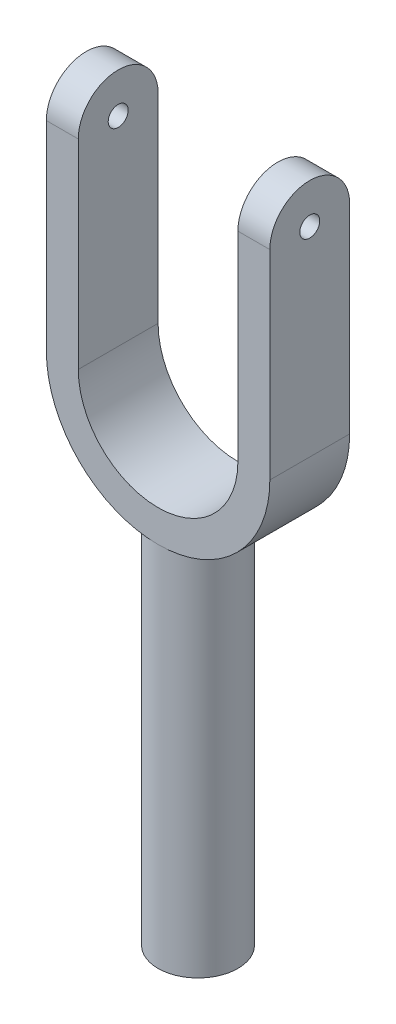
ISO-10303-21;
HEADER;
FILE_DESCRIPTION(('STEP AP214'),'2;1');
FILE_NAME('part.step','',(''),(''),'','','');
FILE_SCHEMA(('AUTOMOTIVE_DESIGN { 1 0 10303 214 1 1 1 1 }'));
ENDSEC;
DATA;
#1=APPLICATION_CONTEXT('core data for automotive mechanical design processes');
#2=APPLICATION_PROTOCOL_DEFINITION('international standard','automotive_design',2000,#1);
#3=PRODUCT_CONTEXT('',#1,'mechanical');
#4=PRODUCT('Part','Part','',(#3));
#5=PRODUCT_RELATED_PRODUCT_CATEGORY('part','',(#4));
#6=PRODUCT_DEFINITION_FORMATION('','',#4);
#7=PRODUCT_DEFINITION_CONTEXT('part definition',#1,'design');
#8=PRODUCT_DEFINITION('design','',#6,#7);
#9=PRODUCT_DEFINITION_SHAPE('','',#8);
#10=(LENGTH_UNIT() NAMED_UNIT(*) SI_UNIT(.MILLI.,.METRE.));
#11=(NAMED_UNIT(*) PLANE_ANGLE_UNIT() SI_UNIT($,.RADIAN.));
#12=(NAMED_UNIT(*) SI_UNIT($,.STERADIAN.) SOLID_ANGLE_UNIT());
#13=UNCERTAINTY_MEASURE_WITH_UNIT(LENGTH_MEASURE(1.E-05),#10,'distance_accuracy_value','');
#14=(GEOMETRIC_REPRESENTATION_CONTEXT(3) GLOBAL_UNCERTAINTY_ASSIGNED_CONTEXT((#13)) GLOBAL_UNIT_ASSIGNED_CONTEXT((#10,
#11,#12)) REPRESENTATION_CONTEXT('',''));
#15=CARTESIAN_POINT('',(0.,0.,0.));
#16=DIRECTION('',(0.,0.,1.));
#17=DIRECTION('',(1.,0.,0.));
#18=AXIS2_PLACEMENT_3D('',#15,#16,#17);
#19=CARTESIAN_POINT('',(0.,0.,25.));
#20=DIRECTION('',(0.,0.,-1.));
#21=DIRECTION('',(-1.,0.,0.));
#22=AXIS2_PLACEMENT_3D('',#19,#20,#21);
#23=CYLINDRICAL_SURFACE('',#22,70.0000000000001);
#24=CARTESIAN_POINT('',(0.,-70.0000000000001,-25.));
#25=CARTESIAN_POINT('',(-0.679180925944925,-70.0000012701264,-25.0000017888725));
#26=CARTESIAN_POINT('',(-1.35833593576467,-69.9900934101398,-24.9723012200254));
#27=CARTESIAN_POINT('',(-2.71154794711081,-69.9507371047099,-24.8617839545253));
#28=CARTESIAN_POINT('',(-3.38560520508728,-69.9212896489382,-24.7789700493372));
#29=CARTESIAN_POINT('',(-4.72365419045248,-69.8436555704296,-24.5590468551552));
#30=CARTESIAN_POINT('',(-5.38764644172705,-69.7954699265233,-24.4219404022457));
#31=CARTESIAN_POINT('',(-6.70090631634505,-69.6816496745706,-24.0947257261692));
#32=CARTESIAN_POINT('',(-7.3501736775428,-69.6160147561408,-23.9046165602));
#33=CARTESIAN_POINT('',(-8.62837866468457,-69.4691601054934,-23.4734993431677));
#34=CARTESIAN_POINT('',(-9.2573520122148,-69.3879697246476,-23.2325870669071));
#35=CARTESIAN_POINT('',(-10.4922185459502,-69.2120102997683,-22.701653568678));
#36=CARTESIAN_POINT('',(-11.0981118604151,-69.1172413312072,-22.4116326196635));
#37=CARTESIAN_POINT('',(-12.2832846972124,-68.9164875007838,-21.7846375289411));
#38=CARTESIAN_POINT('',(-12.8625593297818,-68.8105005899416,-21.4476548059983));
#39=CARTESIAN_POINT('',(-13.9910496212934,-68.5899495050605,-20.7291597525745));
#40=CARTESIAN_POINT('',(-14.5402644271045,-68.4753850878008,-20.3476461592197));
#41=CARTESIAN_POINT('',(-15.6244442062578,-68.2363214951697,-19.5282976693321));
#42=CARTESIAN_POINT('',(-16.1582260560632,-68.1116145298589,-19.0889524001093));
#43=CARTESIAN_POINT('',(-16.9298278264603,-67.9223907842319,-18.3983740008551));
#44=CARTESIAN_POINT('',(-17.1821959894187,-67.8589521964708,-18.1629076594081));
#45=CARTESIAN_POINT('',(-17.6769930980779,-67.7317441516165,-17.6817144778725));
#46=CARTESIAN_POINT('',(-17.919419620755,-67.66797461808,-17.4359851655546));
#47=CARTESIAN_POINT('',(-18.6311822417452,-67.4768135765647,-16.6839872261996));
#48=CARTESIAN_POINT('',(-19.0850367431888,-67.3495608681547,-16.162876950687));
#49=CARTESIAN_POINT('',(-19.9484583144465,-67.0988912003716,-15.0843031394537));
#50=CARTESIAN_POINT('',(-20.3580255554341,-66.9754742261743,-14.5268397442538));
#51=CARTESIAN_POINT('',(-20.9436789370133,-66.7937572348368,-13.6561452204844));
#52=CARTESIAN_POINT('',(-21.1370153397241,-66.7327887338265,-13.3549520302421));
#53=CARTESIAN_POINT('',(-21.5107327660702,-66.6132632569046,-12.7442736575752));
#54=CARTESIAN_POINT('',(-21.6911168736069,-66.5547057083786,-12.4347904732291));
#55=CARTESIAN_POINT('',(-22.2124099879301,-66.3833020172012,-11.4944495413271));
#56=CARTESIAN_POINT('',(-22.5334927319814,-66.2747144923099,-10.8516514539638));
#57=CARTESIAN_POINT('',(-23.1197452689608,-66.0724874425329,-9.53907830218651));
#58=CARTESIAN_POINT('',(-23.3849306630139,-65.9788437485546,-8.8693108273363));
#59=CARTESIAN_POINT('',(-23.8570656154869,-65.8095995522291,-7.50731237889064));
#60=CARTESIAN_POINT('',(-24.0640182337097,-65.7339981018958,-6.81508258769537));
#61=CARTESIAN_POINT('',(-24.4108560480382,-65.6059676833894,-5.44001058565263));
#62=CARTESIAN_POINT('',(-24.5529838744494,-65.5527697368865,-4.75780527226331));
#63=CARTESIAN_POINT('',(-24.7799009878715,-65.4673297562468,-3.38261677847237));
#64=CARTESIAN_POINT('',(-24.8646916243141,-65.4350872289246,-2.68963385211474));
#65=CARTESIAN_POINT('',(-24.975998661004,-65.39268349225,-1.29854767890296));
#66=CARTESIAN_POINT('',(-25.0025334156344,-65.3825153280521,-0.600446114323008));
#67=CARTESIAN_POINT('',(-24.997086189663,-65.3845984253853,0.795482850485619));
#68=CARTESIAN_POINT('',(-24.9651061933431,-65.3968489266816,1.49331025920851));
#69=CARTESIAN_POINT('',(-24.8462687705805,-65.4420862116418,2.84584995416015));
#70=CARTESIAN_POINT('',(-24.7624422149918,-65.4739272568418,3.50086970397224));
#71=CARTESIAN_POINT('',(-24.543520870307,-65.5563059118841,4.80105803799633));
#72=CARTESIAN_POINT('',(-24.4084281849751,-65.606842754521,5.44622702531565));
#73=CARTESIAN_POINT('',(-24.0882016135211,-65.7250912835406,6.72245812130035));
#74=CARTESIAN_POINT('',(-23.9030629687172,-65.7928046031319,7.35351888228634));
#75=CARTESIAN_POINT('',(-23.4843347268727,-65.943426326895,8.59748546358401));
#76=CARTESIAN_POINT('',(-23.2507436769573,-66.0263351867055,9.21039073886254));
#77=CARTESIAN_POINT('',(-22.7324023274212,-66.2066043754767,10.4250470845983));
#78=CARTESIAN_POINT('',(-22.4468192484161,-66.3041946397133,11.026408369599));
#79=CARTESIAN_POINT('',(-21.8295020221087,-66.5099889957458,12.2030422211796));
#80=CARTESIAN_POINT('',(-21.4977676465952,-66.6181931400249,12.7783146587354));
#81=CARTESIAN_POINT('',(-20.790314154227,-66.8423558537089,13.8997313280232));
#82=CARTESIAN_POINT('',(-20.4145835221899,-66.9583164497971,14.4458678793042));
#83=CARTESIAN_POINT('',(-19.6214589540957,-67.1950111379271,15.5060152473019));
#84=CARTESIAN_POINT('',(-19.204063316814,-67.315745424762,16.020024750844));
#85=CARTESIAN_POINT('',(-18.5353963295366,-67.5018294366563,16.779815311856));
#86=CARTESIAN_POINT('',(-18.2981469798808,-67.5665659694663,17.0382161934338));
#87=CARTESIAN_POINT('',(-17.8130541374479,-67.696071716854,17.5447442620807));
#88=CARTESIAN_POINT('',(-17.5652130984215,-67.7608409204637,17.7928738027443));
#89=CARTESIAN_POINT('',(-16.8062137216077,-67.9545709111255,18.521418592806));
#90=CARTESIAN_POINT('',(-16.2795515055306,-68.0829618451124,18.986021386256));
#91=CARTESIAN_POINT('',(-15.188263819508,-68.334693165841,19.8698224306004));
#92=CARTESIAN_POINT('',(-14.6236332005377,-68.4580328639032,20.2890145029842));
#93=CARTESIAN_POINT('',(-13.4598154912955,-68.696332395009,21.0790880589463));
#94=CARTESIAN_POINT('',(-12.8606286361773,-68.8112922850647,21.4499698712182));
#95=CARTESIAN_POINT('',(-11.6235005765033,-69.031108593913,22.1450699786553));
#96=CARTESIAN_POINT('',(-10.9851584227713,-69.1358151381548,22.4686228350996));
#97=CARTESIAN_POINT('',(-9.68116320804216,-69.330437610488,23.0605233270113));
#98=CARTESIAN_POINT('',(-9.01550971611939,-69.4203533050932,23.32887009102));
#99=CARTESIAN_POINT('',(-7.66189266903238,-69.5827554722577,23.8077849637237));
#100=CARTESIAN_POINT('',(-6.97393644485921,-69.6552476073866,24.0183718472401));
#101=CARTESIAN_POINT('',(-5.58075891840453,-69.780686155583,24.3797647320112));
#102=CARTESIAN_POINT('',(-4.87553854461499,-69.8336336173406,24.5305739407325));
#103=CARTESIAN_POINT('',(-3.48828154365024,-69.9163135002796,24.7649405971046));
#104=CARTESIAN_POINT('',(-2.80679875640182,-69.9470549990155,24.8514274091529));
#105=CARTESIAN_POINT('',(-1.4384274815666,-69.9885661065252,24.9680271662592));
#106=CARTESIAN_POINT('',(-0.751539171185793,-69.9993363672876,24.9981419516601));
#107=CARTESIAN_POINT('',(0.622278307785202,-70.0006039599694,25.0016909644371));
#108=CARTESIAN_POINT('',(1.30920744823897,-69.9911048357362,24.9751350999651));
#109=CARTESIAN_POINT('',(2.67797546770134,-69.9521064050935,24.8656350826399));
#110=CARTESIAN_POINT('',(3.3598144118618,-69.9226073551178,24.7826916527737));
#111=CARTESIAN_POINT('',(4.69009118571935,-69.8457708674575,24.5650496063379));
#112=CARTESIAN_POINT('',(5.3388733986258,-69.7990786481027,24.4322198884995));
#113=CARTESIAN_POINT('',(6.62250574852431,-69.6890047457768,24.1159562759875));
#114=CARTESIAN_POINT('',(7.25735628739102,-69.6256235449054,23.9325238430826));
#115=CARTESIAN_POINT('',(8.5090871904933,-69.483755219678,23.5165990158715));
#116=CARTESIAN_POINT('',(9.12596602540446,-69.4052668140538,23.2841024601904));
#117=CARTESIAN_POINT('',(10.3379070082423,-69.2351228512165,22.7719247950542));
#118=CARTESIAN_POINT('',(10.9329684834825,-69.1434668884409,22.4922422322174));
#119=CARTESIAN_POINT('',(12.1143177985488,-68.9464417431281,21.8791779623532));
#120=CARTESIAN_POINT('',(12.699885591798,-68.8407588547123,21.5445048798973));
#121=CARTESIAN_POINT('',(13.5554826550168,-68.6755663592855,21.0086229040792));
#122=CARTESIAN_POINT('',(13.8369034497344,-68.6193877016691,20.8243395970423));
#123=CARTESIAN_POINT('',(14.3918898304214,-68.5051368369523,20.4447193932805));
#124=CARTESIAN_POINT('',(14.6654536730783,-68.447064215628,20.2493800715593));
#125=CARTESIAN_POINT('',(15.4737493174401,-68.2705438234234,19.6472517054354));
#126=CARTESIAN_POINT('',(15.9960963972219,-68.1497913474794,19.2243452643792));
#127=CARTESIAN_POINT('',(17.0046656411807,-67.9051597013927,18.3382651998405));
#128=CARTESIAN_POINT('',(17.4908866535014,-67.7812804317226,17.875090293445));
#129=CARTESIAN_POINT('',(18.2033281374715,-67.5921853425137,17.1395335672721));
#130=CARTESIAN_POINT('',(18.4436363511331,-67.5269695119449,16.8806692677433));
#131=CARTESIAN_POINT('',(18.9130682113762,-67.3969965735359,16.3529977617922));
#132=CARTESIAN_POINT('',(19.1421944546978,-67.3322393622075,16.0841928895581));
#133=CARTESIAN_POINT('',(19.8123770498557,-67.1393016789484,15.2633102174337));
#134=CARTESIAN_POINT('',(20.2362684867918,-67.0124467811318,14.6967321269497));
#135=CARTESIAN_POINT('',(21.0351438505253,-66.7659914056939,13.5286203723206));
#136=CARTESIAN_POINT('',(21.4101240325835,-66.6463914839019,12.927084036796));
#137=CARTESIAN_POINT('',(22.1084268113351,-66.4180129691599,11.6927399359435));
#138=CARTESIAN_POINT('',(22.431750264472,-66.3092341968118,11.0599326893));
#139=CARTESIAN_POINT('',(23.0244122761999,-66.1057849188638,9.76642771567463));
#140=CARTESIAN_POINT('',(23.2936890209956,-66.011130598921,9.10569908804534));
#141=CARTESIAN_POINT('',(23.7753512389981,-65.8391839589918,7.76159023189796));
#142=CARTESIAN_POINT('',(23.9877363589474,-65.7618917468126,7.07820986275789));
#143=CARTESIAN_POINT('',(24.3534019606598,-65.6273557048357,5.69419578711899));
#144=CARTESIAN_POINT('',(24.5067092367632,-65.57010278744,4.99357005588981));
#145=CARTESIAN_POINT('',(24.7526885085429,-65.4776432207795,3.58032834450137));
#146=CARTESIAN_POINT('',(24.8453641951103,-65.442435229556,2.86771309690197));
#147=CARTESIAN_POINT('',(24.9654052979338,-65.3967304134161,1.4784360537139));
#148=CARTESIAN_POINT('',(24.9962853133434,-65.3849042764544,0.802119432788617));
#149=CARTESIAN_POINT('',(25.0030831458586,-65.3823055037871,-0.550815464009211));
#150=CARTESIAN_POINT('',(24.9790032135198,-65.3915320059966,-1.22743372639548));
#151=CARTESIAN_POINT('',(24.8761389677405,-65.430732146903,-2.57582777984353));
#152=CARTESIAN_POINT('',(24.7973588941999,-65.4607041775784,-3.24760394214726));
#153=CARTESIAN_POINT('',(24.5859014832569,-65.5404164074589,-4.58141863365554));
#154=CARTESIAN_POINT('',(24.4532240750698,-65.5901566326261,-5.24345715007022));
#155=CARTESIAN_POINT('',(24.1392673145603,-65.7063391421672,-6.5366135458405));
#156=CARTESIAN_POINT('',(23.9592947388971,-65.7723297285596,-7.16809030267321));
#157=CARTESIAN_POINT('',(23.550915918976,-65.9196589543378,-8.41330511763138));
#158=CARTESIAN_POINT('',(23.3225108136794,-66.0009972327955,-9.02704359251271));
#159=CARTESIAN_POINT('',(22.8190253697003,-66.1767567147497,-10.2332429747148));
#160=CARTESIAN_POINT('',(22.5439365925244,-66.271180282963,-10.8257000117232));
#161=CARTESIAN_POINT('',(21.9491119288141,-66.4705563083536,-11.9858898777569));
#162=CARTESIAN_POINT('',(21.62937422138,-66.5755091948947,-12.5536216971839));
#163=CARTESIAN_POINT('',(20.9306661136645,-66.7985634818032,-13.6884048682217));
#164=CARTESIAN_POINT('',(20.5495684648305,-66.9170563964142,-14.2540747323218));
#165=CARTESIAN_POINT('',(19.944834894965,-67.0987918724771,-15.0771203483552));
#166=CARTESIAN_POINT('',(19.7377296955177,-67.1600400091216,-15.3472404518126));
#167=CARTESIAN_POINT('',(19.3127282349984,-67.283486184683,-15.8787380823859));
#168=CARTESIAN_POINT('',(19.0948295089143,-67.3456844383223,-16.1401135893742));
#169=CARTESIAN_POINT('',(18.4254515729339,-67.5330837813454,-16.910516389615));
#170=CARTESIAN_POINT('',(17.9582724294438,-67.659094971113,-17.4058446891676));
#171=CARTESIAN_POINT('',(16.9849134079008,-67.9099788014804,-18.3568979844149));
#172=CARTESIAN_POINT('',(16.4787330340364,-68.0348514275834,-18.812622476481));
#173=CARTESIAN_POINT('',(15.6800440547176,-68.2218131655967,-19.4746870791341));
#174=CARTESIAN_POINT('',(15.4005634513176,-68.2854841678105,-19.6964452925057));
#175=CARTESIAN_POINT('',(14.8322073101845,-68.4111857699624,-20.1279137366329));
#176=CARTESIAN_POINT('',(14.5433339875633,-68.4732167505039,-20.3376267762217));
#177=CARTESIAN_POINT('',(13.6631190242182,-68.6562311499885,-20.9482461174024));
#178=CARTESIAN_POINT('',(13.0581398738707,-68.7741460824937,-21.3306678905265));
#179=CARTESIAN_POINT('',(11.8160736836227,-68.9983965375514,-22.0429819433391));
#180=CARTESIAN_POINT('',(11.1789876455057,-69.104732421061,-22.3728758606423));
#181=CARTESIAN_POINT('',(9.87690039706431,-69.3028164292254,-22.9774226912103));
#182=CARTESIAN_POINT('',(9.2118996022049,-69.3945647708944,-23.2520764262818));
#183=CARTESIAN_POINT('',(7.85586876974843,-69.5611522427746,-23.7446393332485));
#184=CARTESIAN_POINT('',(7.16473975510546,-69.6359175351333,-23.9623013227626));
#185=CARTESIAN_POINT('',(5.76443021358274,-69.7657917941298,-24.3371455055395));
#186=CARTESIAN_POINT('',(5.05524946975612,-69.8209005244139,-24.4943269715772));
#187=CARTESIAN_POINT('',(3.62482047042624,-69.9097560489538,-24.7464730416028));
#188=CARTESIAN_POINT('',(2.90357623849649,-69.9435098255037,-24.8414579819513));
#189=CARTESIAN_POINT('',(1.45487783958914,-69.9886304356377,-24.9682185684781));
#190=CARTESIAN_POINT('',(0.727424055495679,-69.9999986396551,-24.9999980840615));
#191=CARTESIAN_POINT('',(0.,-70.0000000000001,-25.));
#192=B_SPLINE_CURVE_WITH_KNOTS('',3,(#24,#25,#26,#27,#28,#29,#30,#31,#32,#33,#34,#35,#36,#37,
#38,#39,#40,#41,#42,#43,#44,#45,#46,#47,#48,#49,#50,#51,#52,#53,#54,#55,#56,#57,#58,#59,#60,#61,
#62,#63,#64,#65,#66,#67,#68,#69,#70,#71,#72,#73,#74,#75,#76,#77,#78,#79,#80,#81,#82,#83,#84,#85,
#86,#87,#88,#89,#90,#91,#92,#93,#94,#95,#96,#97,#98,#99,#100,#101,#102,#103,#104,#105,#106,#107,
#108,#109,#110,#111,#112,#113,#114,#115,#116,#117,#118,#119,#120,#121,#122,#123,#124,#125,#126,
#127,#128,#129,#130,#131,#132,#133,#134,#135,#136,#137,#138,#139,#140,#141,#142,#143,#144,#145,
#146,#147,#148,#149,#150,#151,#152,#153,#154,#155,#156,#157,#158,#159,#160,#161,#162,#163,#164,
#165,#166,#167,#168,#169,#170,#171,#172,#173,#174,#175,#176,#177,#178,#179,#180,#181,#182,#183,
#184,#185,#186,#187,#188,#189,#190,#191),.UNSPECIFIED.,.T.,.F.,(4,2,2,2,2,2,2,2,2,2,2,2,2,2,2,2,
2,2,2,2,2,2,2,2,2,2,2,2,2,2,2,2,2,2,2,2,2,2,2,2,2,2,2,2,2,2,2,2,2,2,2,2,2,2,2,2,2,2,2,2,2,2,2,2,
2,2,2,2,2,2,2,2,2,2,2,2,2,2,2,2,2,2,2,4),(0.,2.03686422958561,4.0736253007951,6.11027999157042,
8.14697091227994,10.1798560191319,12.2127298272475,14.2459755867488,16.2792790221256,
18.3841943217108,19.4367647471307,20.4895902035642,22.5950968121171,24.7005952824413,
25.7894812056943,26.8781070029299,29.0551794618605,31.2316434861365,33.4079931281726,
35.5019419652163,37.5958415194268,39.6890812646705,41.7822500277974,43.7633124227688,
45.744293531376,47.7254630703107,49.7066920243992,51.7230091681699,53.7393362826769,
55.756192316996,57.7731307353077,58.8430207471907,59.9126642298287,62.0518240426441,
64.1912745415575,66.3307104833053,68.4978121310909,70.6649479851481,72.8313785756672,
74.9976929071528,77.0580179454529,79.1182757204136,81.1781733146723,83.238044497952,
85.2274014681034,87.216700977405,89.2061692770595,91.1956988657516,93.2413056149411,
94.2642166604427,95.2873529445453,97.3335855758261,99.3798834219345,100.457150337312,
101.534165881535,103.688060448527,105.842119825137,107.996143484782,110.152616859303,
112.309103623715,114.464611174364,116.619987498299,118.648834600476,120.677598624856,
122.706205413873,124.734814867119,126.712385844211,128.689910321005,130.667792634613,
132.645755634985,134.72011130555,135.757408127919,136.794942948973,138.869919325315,
140.944922084582,142.031856641081,143.11853669584,145.291728950664,147.464853440514,
149.637945598455,151.820312276198,154.002705194162,156.184384179639,158.365929599687),.UNSPECIFIED.);
#193=CARTESIAN_POINT('',(0.,-70.0000000000001,25.));
#194=VERTEX_POINT('',#193);
#195=CARTESIAN_POINT('',(0.,-70.0000000000001,-25.));
#196=VERTEX_POINT('',#195);
#197=EDGE_CURVE('E135',#194,#196,#192,.T.);
#198=ORIENTED_EDGE('',*,*,#197,.T.);
#199=CARTESIAN_POINT('',(0.,0.,-25.));
#200=DIRECTION('',(0.,0.,1.));
#201=DIRECTION('',(1.,0.,0.));
#202=AXIS2_PLACEMENT_3D('',#199,#200,#201);
#203=CIRCLE('',#202,70.0000000000001);
#204=CARTESIAN_POINT('',(70.,-2.81746630408685E-06,-25.));
#205=VERTEX_POINT('',#204);
#206=EDGE_CURVE('E123',#196,#205,#203,.T.);
#207=ORIENTED_EDGE('',*,*,#206,.T.);
#208=DIRECTION('',(0.,0.,-1.));
#209=VECTOR('',#208,1.);
#210=CARTESIAN_POINT('',(70.,-2.81746630408685E-06,25.));
#211=LINE('',#210,#209);
#212=CARTESIAN_POINT('',(70.,-2.81746630408685E-06,25.));
#213=VERTEX_POINT('',#212);
#214=EDGE_CURVE('E233',#213,#205,#211,.T.);
#215=ORIENTED_EDGE('',*,*,#214,.F.);
#216=CARTESIAN_POINT('',(0.,0.,25.));
#217=DIRECTION('',(0.,0.,1.));
#218=DIRECTION('',(1.,0.,0.));
#219=AXIS2_PLACEMENT_3D('',#216,#217,#218);
#220=CIRCLE('',#219,70.0000000000001);
#221=EDGE_CURVE('E136',#194,#213,#220,.T.);
#222=ORIENTED_EDGE('',*,*,#221,.F.);
#223=EDGE_LOOP('',(#198,#207,#215,#222));
#224=FACE_BOUND('',#223,.T.);
#225=ADVANCED_FACE('F43',(#224),#23,.T.);
#226=EDGE_CURVE('E60',#196,#194,#192,.T.);
#227=ORIENTED_EDGE('',*,*,#226,.T.);
#228=CARTESIAN_POINT('',(-70.,-2.8174662836225E-06,25.));
#229=VERTEX_POINT('',#228);
#230=EDGE_CURVE('E219',#229,#194,#220,.T.);
#231=ORIENTED_EDGE('',*,*,#230,.F.);
#232=DIRECTION('',(0.,0.,-1.));
#233=VECTOR('',#232,1.);
#234=CARTESIAN_POINT('',(-70.,-2.8174662836225E-06,25.));
#235=LINE('',#234,#233);
#236=CARTESIAN_POINT('',(-70.,-2.8174662836225E-06,-25.));
#237=VERTEX_POINT('',#236);
#238=EDGE_CURVE('E119',#229,#237,#235,.T.);
#239=ORIENTED_EDGE('',*,*,#238,.T.);
#240=EDGE_CURVE('E115',#237,#196,#203,.T.);
#241=ORIENTED_EDGE('',*,*,#240,.T.);
#242=EDGE_LOOP('',(#227,#231,#239,#241));
#243=FACE_BOUND('',#242,.T.);
#244=ADVANCED_FACE('F117',(#243),#23,.T.);
#245=CARTESIAN_POINT('',(70.,124.999997182534,0.));
#246=DIRECTION('',(-1.,0.,0.));
#247=DIRECTION('',(0.,0.,1.));
#248=AXIS2_PLACEMENT_3D('',#245,#246,#247);
#249=CYLINDRICAL_SURFACE('',#248,25.);
#250=DIRECTION('',(1.,0.,0.));
#251=VECTOR('',#250,1.);
#252=CARTESIAN_POINT('',(70.,124.999997182534,25.));
#253=LINE('',#252,#251);
#254=CARTESIAN_POINT('',(70.,124.999997182534,25.));
#255=VERTEX_POINT('',#254);
#256=CARTESIAN_POINT('',(50.,124.999997182534,25.));
#257=VERTEX_POINT('',#256);
#258=EDGE_CURVE('E240',#255,#257,#253,.F.);
#259=ORIENTED_EDGE('',*,*,#258,.F.);
#260=CARTESIAN_POINT('',(70.,124.999997182534,0.));
#261=DIRECTION('',(-1.,0.,0.));
#262=DIRECTION('',(0.,0.,1.));
#263=AXIS2_PLACEMENT_3D('',#260,#261,#262);
#264=CIRCLE('',#263,25.);
#265=CARTESIAN_POINT('',(70.,124.999997182534,-25.));
#266=VERTEX_POINT('',#265);
#267=EDGE_CURVE('E53',#266,#255,#264,.F.);
#268=ORIENTED_EDGE('',*,*,#267,.F.);
#269=DIRECTION('',(-1.,0.,0.));
#270=VECTOR('',#269,1.);
#271=CARTESIAN_POINT('',(0.,124.999997182534,-25.));
#272=LINE('',#271,#270);
#273=CARTESIAN_POINT('',(50.,124.999997182534,-25.));
#274=VERTEX_POINT('',#273);
#275=EDGE_CURVE('E243',#274,#266,#272,.F.);
#276=ORIENTED_EDGE('',*,*,#275,.F.);
#277=CARTESIAN_POINT('',(50.,124.999997182534,0.));
#278=DIRECTION('',(1.,0.,0.));
#279=DIRECTION('',(0.,0.,-1.));
#280=AXIS2_PLACEMENT_3D('',#277,#278,#279);
#281=CIRCLE('',#280,25.);
#282=EDGE_CURVE('E11',#257,#274,#281,.F.);
#283=ORIENTED_EDGE('',*,*,#282,.F.);
#284=EDGE_LOOP('',(#259,#268,#276,#283));
#285=FACE_BOUND('',#284,.T.);
#286=ADVANCED_FACE('F46',(#285),#249,.T.);
#287=CARTESIAN_POINT('',(-50.,124.999997182534,0.));
#288=DIRECTION('',(-1.,0.,0.));
#289=DIRECTION('',(0.,0.,1.));
#290=AXIS2_PLACEMENT_3D('',#287,#288,#289);
#291=CYLINDRICAL_SURFACE('',#290,25.);
#292=DIRECTION('',(1.,0.,0.));
#293=VECTOR('',#292,1.);
#294=CARTESIAN_POINT('',(-50.,124.999997182534,25.));
#295=LINE('',#294,#293);
#296=CARTESIAN_POINT('',(-50.,124.999997182534,25.));
#297=VERTEX_POINT('',#296);
#298=CARTESIAN_POINT('',(-70.,124.999997182534,25.));
#299=VERTEX_POINT('',#298);
#300=EDGE_CURVE('E198',#297,#299,#295,.F.);
#301=ORIENTED_EDGE('',*,*,#300,.F.);
#302=CARTESIAN_POINT('',(-50.,124.999997182534,0.));
#303=DIRECTION('',(-1.,0.,0.));
#304=DIRECTION('',(0.,0.,1.));
#305=AXIS2_PLACEMENT_3D('',#302,#303,#304);
#306=CIRCLE('',#305,25.);
#307=CARTESIAN_POINT('',(-50.,124.999997182534,-25.));
#308=VERTEX_POINT('',#307);
#309=EDGE_CURVE('E201',#308,#297,#306,.F.);
#310=ORIENTED_EDGE('',*,*,#309,.F.);
#311=DIRECTION('',(-1.,0.,0.));
#312=VECTOR('',#311,1.);
#313=CARTESIAN_POINT('',(0.,124.999997182534,-25.));
#314=LINE('',#313,#312);
#315=CARTESIAN_POINT('',(-70.,124.999997182534,-25.));
#316=VERTEX_POINT('',#315);
#317=EDGE_CURVE('E205',#316,#308,#314,.F.);
#318=ORIENTED_EDGE('',*,*,#317,.F.);
#319=CARTESIAN_POINT('',(-70.,124.999997182534,0.));
#320=DIRECTION('',(1.,0.,0.));
#321=DIRECTION('',(0.,0.,-1.));
#322=AXIS2_PLACEMENT_3D('',#319,#320,#321);
#323=CIRCLE('',#322,25.);
#324=EDGE_CURVE('E203',#299,#316,#323,.F.);
#325=ORIENTED_EDGE('',*,*,#324,.F.);
#326=EDGE_LOOP('',(#301,#310,#318,#325));
#327=FACE_BOUND('',#326,.T.);
#328=ADVANCED_FACE('F186',(#327),#291,.T.);
#329=CARTESIAN_POINT('',(0.,0.,25.));
#330=DIRECTION('',(0.,0.,-1.));
#331=DIRECTION('',(-1.,0.,0.));
#332=AXIS2_PLACEMENT_3D('',#329,#330,#331);
#333=CYLINDRICAL_SURFACE('',#332,50.0000000000001);
#334=CARTESIAN_POINT('',(0.,0.,-25.));
#335=DIRECTION('',(0.,0.,-1.));
#336=DIRECTION('',(1.,0.,0.));
#337=AXIS2_PLACEMENT_3D('',#334,#335,#336);
#338=CIRCLE('',#337,50.0000000000001);
#339=CARTESIAN_POINT('',(50.,-2.81746626454054E-06,-25.));
#340=VERTEX_POINT('',#339);
#341=CARTESIAN_POINT('',(-50.,-2.81746626454054E-06,-25.));
#342=VERTEX_POINT('',#341);
#343=EDGE_CURVE('E142',#340,#342,#338,.T.);
#344=ORIENTED_EDGE('',*,*,#343,.T.);
#345=DIRECTION('',(0.,0.,-1.));
#346=VECTOR('',#345,1.);
#347=CARTESIAN_POINT('',(-50.,-2.81746626454054E-06,25.));
#348=LINE('',#347,#346);
#349=CARTESIAN_POINT('',(-50.,-2.81746626454054E-06,25.));
#350=VERTEX_POINT('',#349);
#351=EDGE_CURVE('E206',#350,#342,#348,.T.);
#352=ORIENTED_EDGE('',*,*,#351,.F.);
#353=CARTESIAN_POINT('',(0.,0.,25.));
#354=DIRECTION('',(0.,0.,-1.));
#355=DIRECTION('',(1.,0.,0.));
#356=AXIS2_PLACEMENT_3D('',#353,#354,#355);
#357=CIRCLE('',#356,50.0000000000001);
#358=CARTESIAN_POINT('',(50.,-2.81746626454054E-06,25.));
#359=VERTEX_POINT('',#358);
#360=EDGE_CURVE('E154',#359,#350,#357,.T.);
#361=ORIENTED_EDGE('',*,*,#360,.F.);
#362=DIRECTION('',(0.,0.,-1.));
#363=VECTOR('',#362,1.);
#364=CARTESIAN_POINT('',(50.,-2.81746626454054E-06,25.));
#365=LINE('',#364,#363);
#366=EDGE_CURVE('E224',#359,#340,#365,.T.);
#367=ORIENTED_EDGE('',*,*,#366,.T.);
#368=EDGE_LOOP('',(#344,#352,#361,#367));
#369=FACE_BOUND('',#368,.T.);
#370=ADVANCED_FACE('F183',(#369),#333,.F.);
#371=CARTESIAN_POINT('',(-50.,-2.81746626454054E-06,25.));
#372=DIRECTION('',(-1.,0.,0.));
#373=DIRECTION('',(0.,0.,1.));
#374=AXIS2_PLACEMENT_3D('',#371,#372,#373);
#375=PLANE('',#374);
#376=CARTESIAN_POINT('',(-50.,124.999997182534,0.));
#377=DIRECTION('',(-1.,0.,0.));
#378=DIRECTION('',(0.,0.,1.));
#379=AXIS2_PLACEMENT_3D('',#376,#377,#378);
#380=CIRCLE('',#379,6.25);
#381=CARTESIAN_POINT('',(-50.,124.999997182534,6.25));
#382=VERTEX_POINT('',#381);
#383=EDGE_CURVE('E344',#382,#382,#380,.T.);
#384=ORIENTED_EDGE('',*,*,#383,.T.);
#385=EDGE_LOOP('',(#384));
#386=FACE_BOUND('',#385,.T.);
#387=DIRECTION('',(0.,1.,0.));
#388=VECTOR('',#387,1.);
#389=CARTESIAN_POINT('',(-50.,-2.81746626454054E-06,-25.));
#390=LINE('',#389,#388);
#391=EDGE_CURVE('E144',#342,#308,#390,.T.);
#392=ORIENTED_EDGE('',*,*,#391,.T.);
#393=ORIENTED_EDGE('',*,*,#309,.T.);
#394=DIRECTION('',(0.,1.,0.));
#395=VECTOR('',#394,1.);
#396=CARTESIAN_POINT('',(-50.,-2.81746626454054E-06,25.));
#397=LINE('',#396,#395);
#398=EDGE_CURVE('E209',#350,#297,#397,.T.);
#399=ORIENTED_EDGE('',*,*,#398,.F.);
#400=ORIENTED_EDGE('',*,*,#351,.T.);
#401=EDGE_LOOP('',(#392,#393,#399,#400));
#402=FACE_BOUND('',#401,.T.);
#403=ADVANCED_FACE('F179',(#386,#402),#375,.F.);
#404=CARTESIAN_POINT('',(-70.,-2.8174662836225E-06,25.));
#405=DIRECTION('',(1.,0.,0.));
#406=DIRECTION('',(0.,0.,-1.));
#407=AXIS2_PLACEMENT_3D('',#404,#405,#406);
#408=PLANE('',#407);
#409=CARTESIAN_POINT('',(-70.0000000000001,124.999997182534,0.));
#410=DIRECTION('',(1.,0.,0.));
#411=DIRECTION('',(0.,0.,-1.));
#412=AXIS2_PLACEMENT_3D('',#409,#410,#411);
#413=CIRCLE('',#412,6.25);
#414=CARTESIAN_POINT('',(-70.0000000000001,124.999997182534,-6.25));
#415=VERTEX_POINT('',#414);
#416=EDGE_CURVE('E341',#415,#415,#413,.T.);
#417=ORIENTED_EDGE('',*,*,#416,.T.);
#418=EDGE_LOOP('',(#417));
#419=FACE_BOUND('',#418,.T.);
#420=DIRECTION('',(0.,-1.,0.));
#421=VECTOR('',#420,1.);
#422=CARTESIAN_POINT('',(-70.,-2.8174662836225E-06,25.));
#423=LINE('',#422,#421);
#424=EDGE_CURVE('E215',#299,#229,#423,.T.);
#425=ORIENTED_EDGE('',*,*,#424,.F.);
#426=ORIENTED_EDGE('',*,*,#324,.T.);
#427=DIRECTION('',(0.,-1.,0.));
#428=VECTOR('',#427,1.);
#429=CARTESIAN_POINT('',(-70.,-2.8174662836225E-06,-25.));
#430=LINE('',#429,#428);
#431=EDGE_CURVE('E133',#316,#237,#430,.T.);
#432=ORIENTED_EDGE('',*,*,#431,.T.);
#433=ORIENTED_EDGE('',*,*,#238,.F.);
#434=EDGE_LOOP('',(#425,#426,#432,#433));
#435=FACE_BOUND('',#434,.T.);
#436=ADVANCED_FACE('F173',(#419,#435),#408,.F.);
#437=CARTESIAN_POINT('',(70.,-2.8174662836225E-06,25.));
#438=DIRECTION('',(-1.,0.,0.));
#439=DIRECTION('',(0.,0.,1.));
#440=AXIS2_PLACEMENT_3D('',#437,#438,#439);
#441=PLANE('',#440);
#442=CARTESIAN_POINT('',(70.,124.999997182534,0.));
#443=DIRECTION('',(1.,0.,0.));
#444=DIRECTION('',(0.,0.,-1.));
#445=AXIS2_PLACEMENT_3D('',#442,#443,#444);
#446=CIRCLE('',#445,6.25);
#447=CARTESIAN_POINT('',(70.,124.999997182534,-6.25));
#448=VERTEX_POINT('',#447);
#449=EDGE_CURVE('E348',#448,#448,#446,.T.);
#450=ORIENTED_EDGE('',*,*,#449,.F.);
#451=EDGE_LOOP('',(#450));
#452=FACE_BOUND('',#451,.T.);
#453=DIRECTION('',(0.,1.,0.));
#454=VECTOR('',#453,1.);
#455=CARTESIAN_POINT('',(70.,-2.8174662836225E-06,-25.));
#456=LINE('',#455,#454);
#457=EDGE_CURVE('E122',#205,#266,#456,.T.);
#458=ORIENTED_EDGE('',*,*,#457,.T.);
#459=ORIENTED_EDGE('',*,*,#267,.T.);
#460=DIRECTION('',(0.,1.,0.));
#461=VECTOR('',#460,1.);
#462=CARTESIAN_POINT('',(70.,-2.8174662836225E-06,25.));
#463=LINE('',#462,#461);
#464=EDGE_CURVE('E221',#213,#255,#463,.T.);
#465=ORIENTED_EDGE('',*,*,#464,.F.);
#466=ORIENTED_EDGE('',*,*,#214,.T.);
#467=EDGE_LOOP('',(#458,#459,#465,#466));
#468=FACE_BOUND('',#467,.T.);
#469=ADVANCED_FACE('F169',(#452,#468),#441,.F.);
#470=CARTESIAN_POINT('',(50.,-2.81746626454054E-06,25.));
#471=DIRECTION('',(1.,0.,0.));
#472=DIRECTION('',(0.,0.,-1.));
#473=AXIS2_PLACEMENT_3D('',#470,#471,#472);
#474=PLANE('',#473);
#475=CARTESIAN_POINT('',(50.,124.999997182534,0.));
#476=DIRECTION('',(1.,0.,0.));
#477=DIRECTION('',(0.,0.,-1.));
#478=AXIS2_PLACEMENT_3D('',#475,#476,#477);
#479=CIRCLE('',#478,6.25);
#480=CARTESIAN_POINT('',(50.,124.999997182534,-6.25));
#481=VERTEX_POINT('',#480);
#482=EDGE_CURVE('E48',#481,#481,#479,.T.);
#483=ORIENTED_EDGE('',*,*,#482,.T.);
#484=EDGE_LOOP('',(#483));
#485=FACE_BOUND('',#484,.T.);
#486=DIRECTION('',(0.,-1.,0.));
#487=VECTOR('',#486,1.);
#488=CARTESIAN_POINT('',(50.,-2.81746626454054E-06,25.));
#489=LINE('',#488,#487);
#490=EDGE_CURVE('E223',#257,#359,#489,.T.);
#491=ORIENTED_EDGE('',*,*,#490,.F.);
#492=ORIENTED_EDGE('',*,*,#282,.T.);
#493=DIRECTION('',(0.,-1.,0.));
#494=VECTOR('',#493,1.);
#495=CARTESIAN_POINT('',(50.,-2.81746626454054E-06,-25.));
#496=LINE('',#495,#494);
#497=EDGE_CURVE('E217',#274,#340,#496,.T.);
#498=ORIENTED_EDGE('',*,*,#497,.T.);
#499=ORIENTED_EDGE('',*,*,#366,.F.);
#500=EDGE_LOOP('',(#491,#492,#498,#499));
#501=FACE_BOUND('',#500,.T.);
#502=ADVANCED_FACE('F163',(#485,#501),#474,.F.);
#503=CARTESIAN_POINT('',(0.,0.,25.));
#504=DIRECTION('',(0.,0.,1.));
#505=DIRECTION('',(1.,0.,0.));
#506=AXIS2_PLACEMENT_3D('',#503,#504,#505);
#507=PLANE('',#506);
#508=ORIENTED_EDGE('',*,*,#464,.T.);
#509=ORIENTED_EDGE('',*,*,#258,.T.);
#510=ORIENTED_EDGE('',*,*,#490,.T.);
#511=ORIENTED_EDGE('',*,*,#360,.T.);
#512=ORIENTED_EDGE('',*,*,#398,.T.);
#513=ORIENTED_EDGE('',*,*,#300,.T.);
#514=ORIENTED_EDGE('',*,*,#424,.T.);
#515=ORIENTED_EDGE('',*,*,#230,.T.);
#516=ORIENTED_EDGE('',*,*,#221,.T.);
#517=EDGE_LOOP('',(#508,#509,#510,#511,#512,#513,#514,#515,#516));
#518=FACE_BOUND('',#517,.T.);
#519=ADVANCED_FACE('F160',(#518),#507,.T.);
#520=CARTESIAN_POINT('',(0.,0.,-25.));
#521=DIRECTION('',(0.,0.,1.));
#522=DIRECTION('',(1.,0.,0.));
#523=AXIS2_PLACEMENT_3D('',#520,#521,#522);
#524=PLANE('',#523);
#525=ORIENTED_EDGE('',*,*,#497,.F.);
#526=ORIENTED_EDGE('',*,*,#275,.T.);
#527=ORIENTED_EDGE('',*,*,#457,.F.);
#528=ORIENTED_EDGE('',*,*,#206,.F.);
#529=ORIENTED_EDGE('',*,*,#240,.F.);
#530=ORIENTED_EDGE('',*,*,#431,.F.);
#531=ORIENTED_EDGE('',*,*,#317,.T.);
#532=ORIENTED_EDGE('',*,*,#391,.F.);
#533=ORIENTED_EDGE('',*,*,#343,.F.);
#534=EDGE_LOOP('',(#525,#526,#527,#528,#529,#530,#531,#532,#533));
#535=FACE_BOUND('',#534,.T.);
#536=ADVANCED_FACE('F128',(#535),#524,.F.);
#537=CARTESIAN_POINT('',(0.,150.000997182534,0.));
#538=DIRECTION('',(0.,-1.,0.));
#539=DIRECTION('',(0.,0.,-1.));
#540=AXIS2_PLACEMENT_3D('',#537,#538,#539);
#541=CYLINDRICAL_SURFACE('',#540,25.);
#542=CARTESIAN_POINT('',(0.,-300.,0.));
#543=DIRECTION('',(0.,1.,0.));
#544=DIRECTION('',(0.,0.,1.));
#545=AXIS2_PLACEMENT_3D('',#542,#543,#544);
#546=CIRCLE('',#545,25.);
#547=CARTESIAN_POINT('',(0.,-300.,25.));
#548=VERTEX_POINT('',#547);
#549=EDGE_CURVE('E139',#548,#548,#546,.T.);
#550=ORIENTED_EDGE('',*,*,#549,.T.);
#551=EDGE_LOOP('',(#550));
#552=FACE_BOUND('',#551,.T.);
#553=ORIENTED_EDGE('',*,*,#226,.F.);
#554=ORIENTED_EDGE('',*,*,#197,.F.);
#555=EDGE_LOOP('',(#553,#554));
#556=FACE_BOUND('',#555,.T.);
#557=ADVANCED_FACE('F141',(#552,#556),#541,.T.);
#558=CARTESIAN_POINT('',(0.,-300.,0.));
#559=DIRECTION('',(0.,1.,0.));
#560=DIRECTION('',(0.,0.,1.));
#561=AXIS2_PLACEMENT_3D('',#558,#559,#560);
#562=PLANE('',#561);
#563=ORIENTED_EDGE('',*,*,#549,.F.);
#564=EDGE_LOOP('',(#563));
#565=FACE_BOUND('',#564,.T.);
#566=ADVANCED_FACE('F276',(#565),#562,.F.);
#567=CARTESIAN_POINT('',(-70.0000000000001,124.999997182534,0.));
#568=DIRECTION('',(1.,0.,0.));
#569=DIRECTION('',(0.,0.,-1.));
#570=AXIS2_PLACEMENT_3D('',#567,#568,#569);
#571=CYLINDRICAL_SURFACE('',#570,6.25);
#572=ORIENTED_EDGE('',*,*,#449,.T.);
#573=EDGE_LOOP('',(#572));
#574=FACE_BOUND('',#573,.T.);
#575=ORIENTED_EDGE('',*,*,#482,.F.);
#576=EDGE_LOOP('',(#575));
#577=FACE_BOUND('',#576,.T.);
#578=ADVANCED_FACE('F284',(#574,#577),#571,.F.);
#579=ORIENTED_EDGE('',*,*,#416,.F.);
#580=EDGE_LOOP('',(#579));
#581=FACE_BOUND('',#580,.T.);
#582=ORIENTED_EDGE('',*,*,#383,.F.);
#583=EDGE_LOOP('',(#582));
#584=FACE_BOUND('',#583,.T.);
#585=ADVANCED_FACE('F313',(#581,#584),#571,.F.);
#586=CLOSED_SHELL('',(#225,#244,#286,#328,#370,#403,#436,#469,#502,#519,#536,#557,#566,#578,#585));
#587=MANIFOLD_SOLID_BREP('B2',#586);
#588=ADVANCED_BREP_SHAPE_REPRESENTATION('',(#18,#587),#14);
#589=SHAPE_DEFINITION_REPRESENTATION(#9,#588);
ENDSEC;
END-ISO-10303-21;
